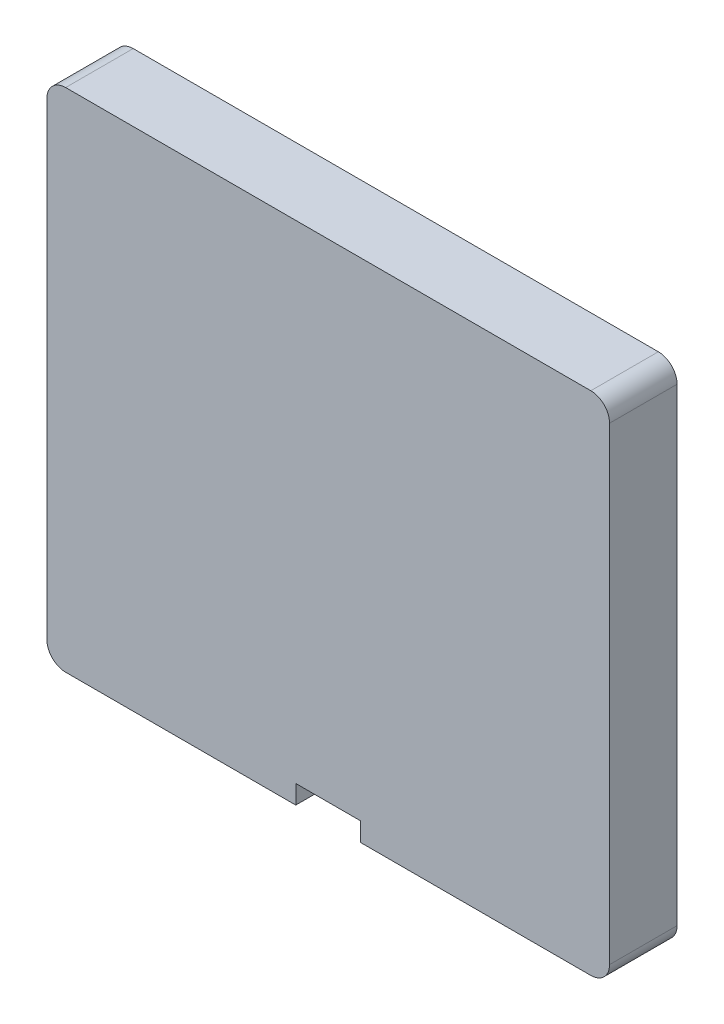
ISO-10303-21;
HEADER;
FILE_DESCRIPTION(('STEP AP214'),'2;1');
FILE_NAME('part.step','',(''),(''),'','','');
FILE_SCHEMA(('AUTOMOTIVE_DESIGN { 1 0 10303 214 1 1 1 1 }'));
ENDSEC;
DATA;
#1=APPLICATION_CONTEXT('core data for automotive mechanical design processes');
#2=APPLICATION_PROTOCOL_DEFINITION('international standard','automotive_design',2000,#1);
#3=PRODUCT_CONTEXT('',#1,'mechanical');
#4=PRODUCT('Part','Part','',(#3));
#5=PRODUCT_RELATED_PRODUCT_CATEGORY('part','',(#4));
#6=PRODUCT_DEFINITION_FORMATION('','',#4);
#7=PRODUCT_DEFINITION_CONTEXT('part definition',#1,'design');
#8=PRODUCT_DEFINITION('design','',#6,#7);
#9=PRODUCT_DEFINITION_SHAPE('','',#8);
#10=(LENGTH_UNIT() NAMED_UNIT(*) SI_UNIT(.MILLI.,.METRE.));
#11=(NAMED_UNIT(*) PLANE_ANGLE_UNIT() SI_UNIT($,.RADIAN.));
#12=(NAMED_UNIT(*) SI_UNIT($,.STERADIAN.) SOLID_ANGLE_UNIT());
#13=UNCERTAINTY_MEASURE_WITH_UNIT(LENGTH_MEASURE(1.E-05),#10,'distance_accuracy_value','');
#14=(GEOMETRIC_REPRESENTATION_CONTEXT(3) GLOBAL_UNCERTAINTY_ASSIGNED_CONTEXT((#13)) GLOBAL_UNIT_ASSIGNED_CONTEXT((#10,
#11,#12)) REPRESENTATION_CONTEXT('',''));
#15=CARTESIAN_POINT('',(0.,0.,0.));
#16=DIRECTION('',(0.,0.,1.));
#17=DIRECTION('',(1.,0.,0.));
#18=AXIS2_PLACEMENT_3D('',#15,#16,#17);
#19=CARTESIAN_POINT('',(70.,62.5,18.));
#20=DIRECTION('',(0.,0.,-1.));
#21=DIRECTION('',(-1.,0.,0.));
#22=AXIS2_PLACEMENT_3D('',#19,#20,#21);
#23=CYLINDRICAL_SURFACE('',#22,5.);
#24=CARTESIAN_POINT('',(70.,62.5,0.));
#25=DIRECTION('',(0.,0.,1.));
#26=DIRECTION('',(-1.,0.,0.));
#27=AXIS2_PLACEMENT_3D('',#24,#25,#26);
#28=CIRCLE('',#27,5.);
#29=CARTESIAN_POINT('',(75.,62.5,0.));
#30=VERTEX_POINT('',#29);
#31=CARTESIAN_POINT('',(70.,67.5,0.));
#32=VERTEX_POINT('',#31);
#33=EDGE_CURVE('E164',#30,#32,#28,.T.);
#34=ORIENTED_EDGE('',*,*,#33,.T.);
#35=DIRECTION('',(0.,0.,-1.));
#36=VECTOR('',#35,1.);
#37=CARTESIAN_POINT('',(70.,67.5,18.));
#38=LINE('',#37,#36);
#39=CARTESIAN_POINT('',(70.,67.5,18.));
#40=VERTEX_POINT('',#39);
#41=EDGE_CURVE('E11',#40,#32,#38,.T.);
#42=ORIENTED_EDGE('',*,*,#41,.F.);
#43=CARTESIAN_POINT('',(70.,62.5,18.));
#44=DIRECTION('',(0.,0.,1.));
#45=DIRECTION('',(-1.,0.,0.));
#46=AXIS2_PLACEMENT_3D('',#43,#44,#45);
#47=CIRCLE('',#46,5.);
#48=CARTESIAN_POINT('',(75.,62.5,18.));
#49=VERTEX_POINT('',#48);
#50=EDGE_CURVE('E198',#49,#40,#47,.T.);
#51=ORIENTED_EDGE('',*,*,#50,.F.);
#52=DIRECTION('',(0.,0.,-1.));
#53=VECTOR('',#52,1.);
#54=CARTESIAN_POINT('',(75.,62.5,18.));
#55=LINE('',#54,#53);
#56=EDGE_CURVE('E160',#49,#30,#55,.T.);
#57=ORIENTED_EDGE('',*,*,#56,.T.);
#58=EDGE_LOOP('',(#34,#42,#51,#57));
#59=FACE_BOUND('',#58,.T.);
#60=ADVANCED_FACE('F39',(#59),#23,.T.);
#61=CARTESIAN_POINT('',(-70.,67.5,18.));
#62=DIRECTION('',(0.,-1.,0.));
#63=DIRECTION('',(0.,0.,-1.));
#64=AXIS2_PLACEMENT_3D('',#61,#62,#63);
#65=PLANE('',#64);
#66=DIRECTION('',(-1.,0.,0.));
#67=VECTOR('',#66,1.);
#68=CARTESIAN_POINT('',(-70.,67.5,0.));
#69=LINE('',#68,#67);
#70=CARTESIAN_POINT('',(-70.,67.5,0.));
#71=VERTEX_POINT('',#70);
#72=EDGE_CURVE('E168',#32,#71,#69,.T.);
#73=ORIENTED_EDGE('',*,*,#72,.T.);
#74=DIRECTION('',(0.,0.,-1.));
#75=VECTOR('',#74,1.);
#76=CARTESIAN_POINT('',(-70.,67.5,18.));
#77=LINE('',#76,#75);
#78=CARTESIAN_POINT('',(-70.,67.5,18.));
#79=VERTEX_POINT('',#78);
#80=EDGE_CURVE('E48',#79,#71,#77,.T.);
#81=ORIENTED_EDGE('',*,*,#80,.F.);
#82=DIRECTION('',(-1.,0.,0.));
#83=VECTOR('',#82,1.);
#84=CARTESIAN_POINT('',(-70.,67.5,18.));
#85=LINE('',#84,#83);
#86=EDGE_CURVE('E111',#40,#79,#85,.T.);
#87=ORIENTED_EDGE('',*,*,#86,.F.);
#88=ORIENTED_EDGE('',*,*,#41,.T.);
#89=EDGE_LOOP('',(#73,#81,#87,#88));
#90=FACE_BOUND('',#89,.T.);
#91=ADVANCED_FACE('F292',(#90),#65,.F.);
#92=CARTESIAN_POINT('',(-70.,62.5,18.));
#93=DIRECTION('',(0.,0.,-1.));
#94=DIRECTION('',(-1.,0.,0.));
#95=AXIS2_PLACEMENT_3D('',#92,#93,#94);
#96=CYLINDRICAL_SURFACE('',#95,5.);
#97=CARTESIAN_POINT('',(-70.,62.5,0.));
#98=DIRECTION('',(0.,0.,1.));
#99=DIRECTION('',(-1.,0.,0.));
#100=AXIS2_PLACEMENT_3D('',#97,#98,#99);
#101=CIRCLE('',#100,5.);
#102=CARTESIAN_POINT('',(-75.,62.5,0.));
#103=VERTEX_POINT('',#102);
#104=EDGE_CURVE('E171',#71,#103,#101,.T.);
#105=ORIENTED_EDGE('',*,*,#104,.T.);
#106=DIRECTION('',(0.,0.,-1.));
#107=VECTOR('',#106,1.);
#108=CARTESIAN_POINT('',(-75.,62.5,18.));
#109=LINE('',#108,#107);
#110=CARTESIAN_POINT('',(-75.,62.5,18.));
#111=VERTEX_POINT('',#110);
#112=EDGE_CURVE('E225',#111,#103,#109,.T.);
#113=ORIENTED_EDGE('',*,*,#112,.F.);
#114=CARTESIAN_POINT('',(-70.,62.5,18.));
#115=DIRECTION('',(0.,0.,1.));
#116=DIRECTION('',(-1.,0.,0.));
#117=AXIS2_PLACEMENT_3D('',#114,#115,#116);
#118=CIRCLE('',#117,5.);
#119=EDGE_CURVE('E235',#79,#111,#118,.T.);
#120=ORIENTED_EDGE('',*,*,#119,.F.);
#121=ORIENTED_EDGE('',*,*,#80,.T.);
#122=EDGE_LOOP('',(#105,#113,#120,#121));
#123=FACE_BOUND('',#122,.T.);
#124=ADVANCED_FACE('F233',(#123),#96,.T.);
#125=CARTESIAN_POINT('',(-75.,-62.5,18.));
#126=DIRECTION('',(1.,0.,0.));
#127=DIRECTION('',(0.,0.,-1.));
#128=AXIS2_PLACEMENT_3D('',#125,#126,#127);
#129=PLANE('',#128);
#130=DIRECTION('',(0.,-1.,0.));
#131=VECTOR('',#130,1.);
#132=CARTESIAN_POINT('',(-75.,-62.5,0.));
#133=LINE('',#132,#131);
#134=CARTESIAN_POINT('',(-75.,-62.5,0.));
#135=VERTEX_POINT('',#134);
#136=EDGE_CURVE('E174',#103,#135,#133,.T.);
#137=ORIENTED_EDGE('',*,*,#136,.T.);
#138=DIRECTION('',(0.,0.,-1.));
#139=VECTOR('',#138,1.);
#140=CARTESIAN_POINT('',(-75.,-62.5,18.));
#141=LINE('',#140,#139);
#142=CARTESIAN_POINT('',(-75.,-62.5,18.));
#143=VERTEX_POINT('',#142);
#144=EDGE_CURVE('E221',#143,#135,#141,.T.);
#145=ORIENTED_EDGE('',*,*,#144,.F.);
#146=DIRECTION('',(0.,-1.,0.));
#147=VECTOR('',#146,1.);
#148=CARTESIAN_POINT('',(-75.,-62.5,18.));
#149=LINE('',#148,#147);
#150=EDGE_CURVE('E254',#111,#143,#149,.T.);
#151=ORIENTED_EDGE('',*,*,#150,.F.);
#152=ORIENTED_EDGE('',*,*,#112,.T.);
#153=EDGE_LOOP('',(#137,#145,#151,#152));
#154=FACE_BOUND('',#153,.T.);
#155=ADVANCED_FACE('F244',(#154),#129,.F.);
#156=CARTESIAN_POINT('',(-70.,-62.5,18.));
#157=DIRECTION('',(0.,0.,-1.));
#158=DIRECTION('',(-1.,0.,0.));
#159=AXIS2_PLACEMENT_3D('',#156,#157,#158);
#160=CYLINDRICAL_SURFACE('',#159,5.);
#161=CARTESIAN_POINT('',(-70.,-62.5,0.));
#162=DIRECTION('',(0.,0.,1.));
#163=DIRECTION('',(-1.,0.,0.));
#164=AXIS2_PLACEMENT_3D('',#161,#162,#163);
#165=CIRCLE('',#164,5.);
#166=CARTESIAN_POINT('',(-70.,-67.5,0.));
#167=VERTEX_POINT('',#166);
#168=EDGE_CURVE('E177',#135,#167,#165,.T.);
#169=ORIENTED_EDGE('',*,*,#168,.T.);
#170=DIRECTION('',(0.,0.,-1.));
#171=VECTOR('',#170,1.);
#172=CARTESIAN_POINT('',(-70.,-67.5,18.));
#173=LINE('',#172,#171);
#174=CARTESIAN_POINT('',(-70.,-67.5,18.));
#175=VERTEX_POINT('',#174);
#176=EDGE_CURVE('E217',#175,#167,#173,.T.);
#177=ORIENTED_EDGE('',*,*,#176,.F.);
#178=CARTESIAN_POINT('',(-70.,-62.5,18.));
#179=DIRECTION('',(0.,0.,1.));
#180=DIRECTION('',(-1.,0.,0.));
#181=AXIS2_PLACEMENT_3D('',#178,#179,#180);
#182=CIRCLE('',#181,5.);
#183=EDGE_CURVE('E250',#143,#175,#182,.T.);
#184=ORIENTED_EDGE('',*,*,#183,.F.);
#185=ORIENTED_EDGE('',*,*,#144,.T.);
#186=EDGE_LOOP('',(#169,#177,#184,#185));
#187=FACE_BOUND('',#186,.T.);
#188=ADVANCED_FACE('F248',(#187),#160,.T.);
#189=CARTESIAN_POINT('',(-70.,-67.5,18.));
#190=DIRECTION('',(0.,1.,0.));
#191=DIRECTION('',(0.,0.,1.));
#192=AXIS2_PLACEMENT_3D('',#189,#190,#191);
#193=PLANE('',#192);
#194=DIRECTION('',(1.,0.,0.));
#195=VECTOR('',#194,1.);
#196=CARTESIAN_POINT('',(-70.,-67.5,0.));
#197=LINE('',#196,#195);
#198=CARTESIAN_POINT('',(-8.66025403784439,-67.5,0.));
#199=VERTEX_POINT('',#198);
#200=EDGE_CURVE('E180',#167,#199,#197,.T.);
#201=ORIENTED_EDGE('',*,*,#200,.T.);
#202=DIRECTION('',(0.,0.,-1.));
#203=VECTOR('',#202,1.);
#204=CARTESIAN_POINT('',(-8.66025403784439,-67.5,18.));
#205=LINE('',#204,#203);
#206=CARTESIAN_POINT('',(-8.66025403784439,-67.5,18.));
#207=VERTEX_POINT('',#206);
#208=EDGE_CURVE('E213',#207,#199,#205,.T.);
#209=ORIENTED_EDGE('',*,*,#208,.F.);
#210=DIRECTION('',(1.,0.,0.));
#211=VECTOR('',#210,1.);
#212=CARTESIAN_POINT('',(-70.,-67.5,18.));
#213=LINE('',#212,#211);
#214=EDGE_CURVE('E253',#175,#207,#213,.T.);
#215=ORIENTED_EDGE('',*,*,#214,.F.);
#216=ORIENTED_EDGE('',*,*,#176,.T.);
#217=EDGE_LOOP('',(#201,#209,#215,#216));
#218=FACE_BOUND('',#217,.T.);
#219=ADVANCED_FACE('F305',(#218),#193,.F.);
#220=CARTESIAN_POINT('',(-8.66025403784439,-67.5,18.));
#221=DIRECTION('',(-1.,0.,0.));
#222=DIRECTION('',(0.,-1.,0.));
#223=AXIS2_PLACEMENT_3D('',#220,#221,#222);
#224=PLANE('',#223);
#225=DIRECTION('',(0.,1.,0.));
#226=VECTOR('',#225,1.);
#227=CARTESIAN_POINT('',(-8.66025403784439,-67.5,0.));
#228=LINE('',#227,#226);
#229=CARTESIAN_POINT('',(-8.66025403784438,-62.5,0.));
#230=VERTEX_POINT('',#229);
#231=EDGE_CURVE('E183',#199,#230,#228,.T.);
#232=ORIENTED_EDGE('',*,*,#231,.T.);
#233=DIRECTION('',(0.,0.,-1.));
#234=VECTOR('',#233,1.);
#235=CARTESIAN_POINT('',(-8.66025403784438,-62.5,18.));
#236=LINE('',#235,#234);
#237=CARTESIAN_POINT('',(-8.66025403784438,-62.5,18.));
#238=VERTEX_POINT('',#237);
#239=EDGE_CURVE('E209',#238,#230,#236,.T.);
#240=ORIENTED_EDGE('',*,*,#239,.F.);
#241=DIRECTION('',(0.,1.,0.));
#242=VECTOR('',#241,1.);
#243=CARTESIAN_POINT('',(-8.66025403784439,-67.5,18.));
#244=LINE('',#243,#242);
#245=EDGE_CURVE('E258',#207,#238,#244,.T.);
#246=ORIENTED_EDGE('',*,*,#245,.F.);
#247=ORIENTED_EDGE('',*,*,#208,.T.);
#248=EDGE_LOOP('',(#232,#240,#246,#247));
#249=FACE_BOUND('',#248,.T.);
#250=ADVANCED_FACE('F308',(#249),#224,.F.);
#251=CARTESIAN_POINT('',(8.66025403784438,-62.5,18.));
#252=DIRECTION('',(0.,1.,0.));
#253=DIRECTION('',(0.,0.,1.));
#254=AXIS2_PLACEMENT_3D('',#251,#252,#253);
#255=PLANE('',#254);
#256=DIRECTION('',(1.,0.,0.));
#257=VECTOR('',#256,1.);
#258=CARTESIAN_POINT('',(8.66025403784438,-62.5,0.));
#259=LINE('',#258,#257);
#260=CARTESIAN_POINT('',(8.66025403784438,-62.5,0.));
#261=VERTEX_POINT('',#260);
#262=EDGE_CURVE('E186',#230,#261,#259,.T.);
#263=ORIENTED_EDGE('',*,*,#262,.T.);
#264=DIRECTION('',(0.,0.,-1.));
#265=VECTOR('',#264,1.);
#266=CARTESIAN_POINT('',(8.66025403784438,-62.5,18.));
#267=LINE('',#266,#265);
#268=CARTESIAN_POINT('',(8.66025403784438,-62.5,18.));
#269=VERTEX_POINT('',#268);
#270=EDGE_CURVE('E205',#269,#261,#267,.T.);
#271=ORIENTED_EDGE('',*,*,#270,.F.);
#272=DIRECTION('',(1.,0.,0.));
#273=VECTOR('',#272,1.);
#274=CARTESIAN_POINT('',(8.66025403784438,-62.5,18.));
#275=LINE('',#274,#273);
#276=EDGE_CURVE('E265',#238,#269,#275,.T.);
#277=ORIENTED_EDGE('',*,*,#276,.F.);
#278=ORIENTED_EDGE('',*,*,#239,.T.);
#279=EDGE_LOOP('',(#263,#271,#277,#278));
#280=FACE_BOUND('',#279,.T.);
#281=ADVANCED_FACE('F273',(#280),#255,.F.);
#282=CARTESIAN_POINT('',(8.66025403784439,-67.5,18.));
#283=DIRECTION('',(1.,0.,0.));
#284=DIRECTION('',(0.,1.,0.));
#285=AXIS2_PLACEMENT_3D('',#282,#283,#284);
#286=PLANE('',#285);
#287=DIRECTION('',(0.,-1.,0.));
#288=VECTOR('',#287,1.);
#289=CARTESIAN_POINT('',(8.66025403784439,-67.5,0.));
#290=LINE('',#289,#288);
#291=CARTESIAN_POINT('',(8.66025403784439,-67.5,0.));
#292=VERTEX_POINT('',#291);
#293=EDGE_CURVE('E189',#261,#292,#290,.T.);
#294=ORIENTED_EDGE('',*,*,#293,.T.);
#295=DIRECTION('',(0.,0.,-1.));
#296=VECTOR('',#295,1.);
#297=CARTESIAN_POINT('',(8.66025403784439,-67.5,18.));
#298=LINE('',#297,#296);
#299=CARTESIAN_POINT('',(8.66025403784439,-67.5,18.));
#300=VERTEX_POINT('',#299);
#301=EDGE_CURVE('E153',#300,#292,#298,.T.);
#302=ORIENTED_EDGE('',*,*,#301,.F.);
#303=DIRECTION('',(0.,-1.,0.));
#304=VECTOR('',#303,1.);
#305=CARTESIAN_POINT('',(8.66025403784439,-67.5,18.));
#306=LINE('',#305,#304);
#307=EDGE_CURVE('E142',#269,#300,#306,.T.);
#308=ORIENTED_EDGE('',*,*,#307,.F.);
#309=ORIENTED_EDGE('',*,*,#270,.T.);
#310=EDGE_LOOP('',(#294,#302,#308,#309));
#311=FACE_BOUND('',#310,.T.);
#312=ADVANCED_FACE('F277',(#311),#286,.F.);
#313=CARTESIAN_POINT('',(8.66025403784439,-67.5,18.));
#314=DIRECTION('',(0.,1.,0.));
#315=DIRECTION('',(0.,0.,1.));
#316=AXIS2_PLACEMENT_3D('',#313,#314,#315);
#317=PLANE('',#316);
#318=DIRECTION('',(1.,0.,0.));
#319=VECTOR('',#318,1.);
#320=CARTESIAN_POINT('',(8.66025403784439,-67.5,0.));
#321=LINE('',#320,#319);
#322=CARTESIAN_POINT('',(70.,-67.5,0.));
#323=VERTEX_POINT('',#322);
#324=EDGE_CURVE('E151',#292,#323,#321,.T.);
#325=ORIENTED_EDGE('',*,*,#324,.T.);
#326=DIRECTION('',(0.,0.,-1.));
#327=VECTOR('',#326,1.);
#328=CARTESIAN_POINT('',(70.,-67.5,18.));
#329=LINE('',#328,#327);
#330=CARTESIAN_POINT('',(70.,-67.5,18.));
#331=VERTEX_POINT('',#330);
#332=EDGE_CURVE('E148',#331,#323,#329,.T.);
#333=ORIENTED_EDGE('',*,*,#332,.F.);
#334=DIRECTION('',(1.,0.,0.));
#335=VECTOR('',#334,1.);
#336=CARTESIAN_POINT('',(8.66025403784439,-67.5,18.));
#337=LINE('',#336,#335);
#338=EDGE_CURVE('E136',#300,#331,#337,.T.);
#339=ORIENTED_EDGE('',*,*,#338,.F.);
#340=ORIENTED_EDGE('',*,*,#301,.T.);
#341=EDGE_LOOP('',(#325,#333,#339,#340));
#342=FACE_BOUND('',#341,.T.);
#343=ADVANCED_FACE('F149',(#342),#317,.F.);
#344=CARTESIAN_POINT('',(70.,-62.5,18.));
#345=DIRECTION('',(0.,0.,-1.));
#346=DIRECTION('',(-1.,0.,0.));
#347=AXIS2_PLACEMENT_3D('',#344,#345,#346);
#348=CYLINDRICAL_SURFACE('',#347,5.);
#349=CARTESIAN_POINT('',(70.,-62.5,0.));
#350=DIRECTION('',(0.,0.,1.));
#351=DIRECTION('',(1.,0.,0.));
#352=AXIS2_PLACEMENT_3D('',#349,#350,#351);
#353=CIRCLE('',#352,5.);
#354=CARTESIAN_POINT('',(75.,-62.5,0.));
#355=VERTEX_POINT('',#354);
#356=EDGE_CURVE('E97',#323,#355,#353,.T.);
#357=ORIENTED_EDGE('',*,*,#356,.T.);
#358=DIRECTION('',(0.,0.,-1.));
#359=VECTOR('',#358,1.);
#360=CARTESIAN_POINT('',(75.,-62.5,18.));
#361=LINE('',#360,#359);
#362=CARTESIAN_POINT('',(75.,-62.5,18.));
#363=VERTEX_POINT('',#362);
#364=EDGE_CURVE('E154',#363,#355,#361,.T.);
#365=ORIENTED_EDGE('',*,*,#364,.F.);
#366=CARTESIAN_POINT('',(70.,-62.5,18.));
#367=DIRECTION('',(0.,0.,1.));
#368=DIRECTION('',(1.,0.,0.));
#369=AXIS2_PLACEMENT_3D('',#366,#367,#368);
#370=CIRCLE('',#369,5.);
#371=EDGE_CURVE('E140',#331,#363,#370,.T.);
#372=ORIENTED_EDGE('',*,*,#371,.F.);
#373=ORIENTED_EDGE('',*,*,#332,.T.);
#374=EDGE_LOOP('',(#357,#365,#372,#373));
#375=FACE_BOUND('',#374,.T.);
#376=ADVANCED_FACE('F156',(#375),#348,.T.);
#377=CARTESIAN_POINT('',(75.,-62.5,18.));
#378=DIRECTION('',(-1.,0.,0.));
#379=DIRECTION('',(0.,0.,1.));
#380=AXIS2_PLACEMENT_3D('',#377,#378,#379);
#381=PLANE('',#380);
#382=DIRECTION('',(0.,1.,0.));
#383=VECTOR('',#382,1.);
#384=CARTESIAN_POINT('',(75.,-62.5,0.));
#385=LINE('',#384,#383);
#386=EDGE_CURVE('E103',#355,#30,#385,.T.);
#387=ORIENTED_EDGE('',*,*,#386,.T.);
#388=ORIENTED_EDGE('',*,*,#56,.F.);
#389=DIRECTION('',(0.,1.,0.));
#390=VECTOR('',#389,1.);
#391=CARTESIAN_POINT('',(75.,-62.5,18.));
#392=LINE('',#391,#390);
#393=EDGE_CURVE('E56',#363,#49,#392,.T.);
#394=ORIENTED_EDGE('',*,*,#393,.F.);
#395=ORIENTED_EDGE('',*,*,#364,.T.);
#396=EDGE_LOOP('',(#387,#388,#394,#395));
#397=FACE_BOUND('',#396,.T.);
#398=ADVANCED_FACE('F281',(#397),#381,.F.);
#399=CARTESIAN_POINT('',(70.,62.5,18.));
#400=DIRECTION('',(0.,0.,-1.));
#401=DIRECTION('',(-1.,0.,0.));
#402=AXIS2_PLACEMENT_3D('',#399,#400,#401);
#403=PLANE('',#402);
#404=ORIENTED_EDGE('',*,*,#50,.T.);
#405=ORIENTED_EDGE('',*,*,#86,.T.);
#406=ORIENTED_EDGE('',*,*,#119,.T.);
#407=ORIENTED_EDGE('',*,*,#150,.T.);
#408=ORIENTED_EDGE('',*,*,#183,.T.);
#409=ORIENTED_EDGE('',*,*,#214,.T.);
#410=ORIENTED_EDGE('',*,*,#245,.T.);
#411=ORIENTED_EDGE('',*,*,#276,.T.);
#412=ORIENTED_EDGE('',*,*,#307,.T.);
#413=ORIENTED_EDGE('',*,*,#338,.T.);
#414=ORIENTED_EDGE('',*,*,#371,.T.);
#415=ORIENTED_EDGE('',*,*,#393,.T.);
#416=EDGE_LOOP('',(#404,#405,#406,#407,#408,#409,#410,#411,#412,#413,#414,#415));
#417=FACE_BOUND('',#416,.T.);
#418=ADVANCED_FACE('F138',(#417),#403,.F.);
#419=CARTESIAN_POINT('',(70.,62.5,0.));
#420=DIRECTION('',(0.,0.,-1.));
#421=DIRECTION('',(-1.,0.,0.));
#422=AXIS2_PLACEMENT_3D('',#419,#420,#421);
#423=PLANE('',#422);
#424=ORIENTED_EDGE('',*,*,#33,.F.);
#425=ORIENTED_EDGE('',*,*,#386,.F.);
#426=ORIENTED_EDGE('',*,*,#356,.F.);
#427=ORIENTED_EDGE('',*,*,#324,.F.);
#428=ORIENTED_EDGE('',*,*,#293,.F.);
#429=ORIENTED_EDGE('',*,*,#262,.F.);
#430=ORIENTED_EDGE('',*,*,#231,.F.);
#431=ORIENTED_EDGE('',*,*,#200,.F.);
#432=ORIENTED_EDGE('',*,*,#168,.F.);
#433=ORIENTED_EDGE('',*,*,#136,.F.);
#434=ORIENTED_EDGE('',*,*,#104,.F.);
#435=ORIENTED_EDGE('',*,*,#72,.F.);
#436=EDGE_LOOP('',(#424,#425,#426,#427,#428,#429,#430,#431,#432,#433,#434,#435));
#437=FACE_BOUND('',#436,.T.);
#438=ADVANCED_FACE('F239',(#437),#423,.T.);
#439=CLOSED_SHELL('',(#60,#91,#124,#155,#188,#219,#250,#281,#312,#343,#376,#398,#418,#438));
#440=MANIFOLD_SOLID_BREP('B2',#439);
#441=ADVANCED_BREP_SHAPE_REPRESENTATION('',(#18,#440),#14);
#442=SHAPE_DEFINITION_REPRESENTATION(#9,#441);
ENDSEC;
END-ISO-10303-21;
